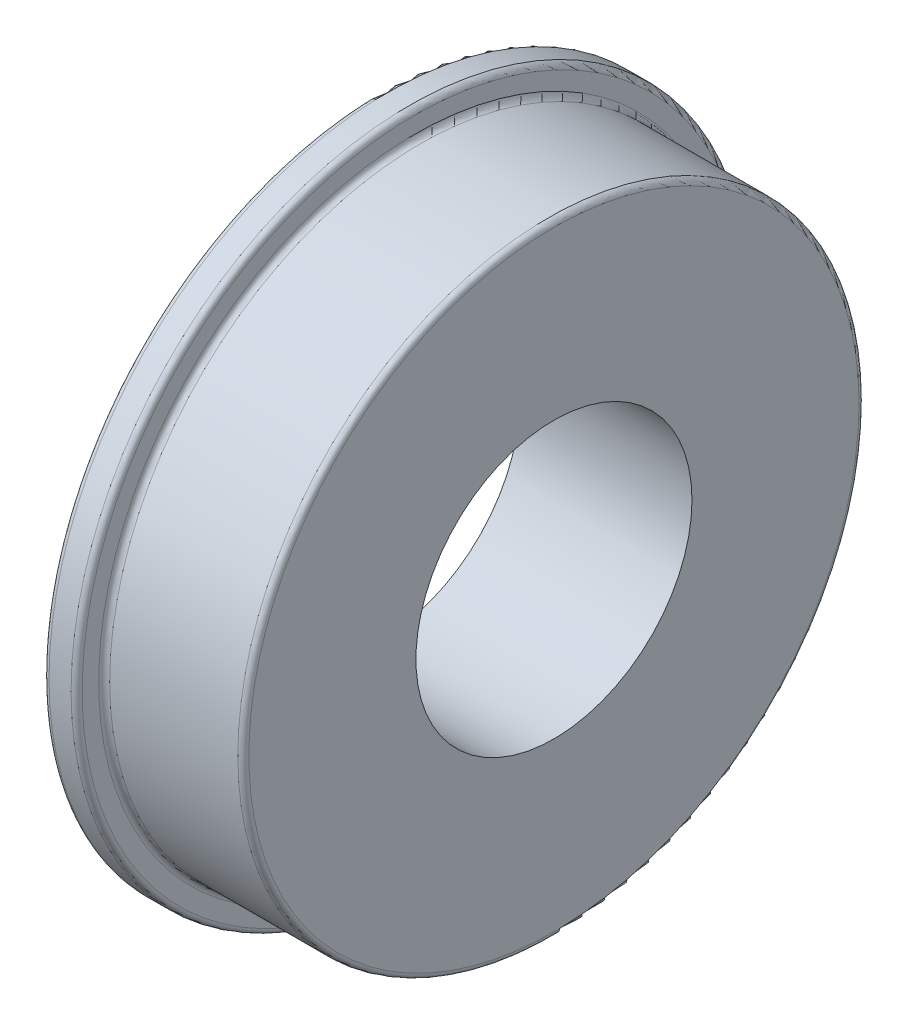
ISO-10303-21;
HEADER;
FILE_DESCRIPTION(('STEP AP214'),'2;1');
FILE_NAME('part.step','',(''),(''),'','','');
FILE_SCHEMA(('AUTOMOTIVE_DESIGN { 1 0 10303 214 1 1 1 1 }'));
ENDSEC;
DATA;
#1=APPLICATION_CONTEXT('core data for automotive mechanical design processes');
#2=APPLICATION_PROTOCOL_DEFINITION('international standard','automotive_design',2000,#1);
#3=PRODUCT_CONTEXT('',#1,'mechanical');
#4=PRODUCT('Part','Part','',(#3));
#5=PRODUCT_RELATED_PRODUCT_CATEGORY('part','',(#4));
#6=PRODUCT_DEFINITION_FORMATION('','',#4);
#7=PRODUCT_DEFINITION_CONTEXT('part definition',#1,'design');
#8=PRODUCT_DEFINITION('design','',#6,#7);
#9=PRODUCT_DEFINITION_SHAPE('','',#8);
#10=(LENGTH_UNIT() NAMED_UNIT(*) SI_UNIT(.MILLI.,.METRE.));
#11=(NAMED_UNIT(*) PLANE_ANGLE_UNIT() SI_UNIT($,.RADIAN.));
#12=(NAMED_UNIT(*) SI_UNIT($,.STERADIAN.) SOLID_ANGLE_UNIT());
#13=UNCERTAINTY_MEASURE_WITH_UNIT(LENGTH_MEASURE(1.E-05),#10,'distance_accuracy_value','');
#14=(GEOMETRIC_REPRESENTATION_CONTEXT(3) GLOBAL_UNCERTAINTY_ASSIGNED_CONTEXT((#13)) GLOBAL_UNIT_ASSIGNED_CONTEXT((#10,
#11,#12)) REPRESENTATION_CONTEXT('',''));
#15=CARTESIAN_POINT('',(0.,0.,0.));
#16=DIRECTION('',(0.,0.,1.));
#17=DIRECTION('',(1.,0.,0.));
#18=AXIS2_PLACEMENT_3D('',#15,#16,#17);
#19=CARTESIAN_POINT('',(1.524,0.,0.));
#20=DIRECTION('',(1.,0.,0.));
#21=DIRECTION('',(0.,0.,-1.));
#22=AXIS2_PLACEMENT_3D('',#19,#20,#21);
#23=PLANE('',#22);
#24=CARTESIAN_POINT('',(1.524,0.,0.));
#25=DIRECTION('',(1.,0.,0.));
#26=DIRECTION('',(0.,0.,-1.));
#27=AXIS2_PLACEMENT_3D('',#24,#25,#26);
#28=CIRCLE('',#27,15.3035);
#29=CARTESIAN_POINT('',(1.524,0.,-15.3035));
#30=VERTEX_POINT('',#29);
#31=EDGE_CURVE('E56',#30,#30,#28,.T.);
#32=ORIENTED_EDGE('',*,*,#31,.T.);
#33=EDGE_LOOP('',(#32));
#34=FACE_BOUND('',#33,.T.);
#35=CARTESIAN_POINT('',(1.524,0.,0.));
#36=DIRECTION('',(1.,0.,0.));
#37=DIRECTION('',(0.,0.,-1.));
#38=AXIS2_PLACEMENT_3D('',#35,#36,#37);
#39=CIRCLE('',#38,14.5415);
#40=CARTESIAN_POINT('',(1.524,0.,-14.5415));
#41=VERTEX_POINT('',#40);
#42=EDGE_CURVE('E59',#41,#41,#39,.F.);
#43=ORIENTED_EDGE('',*,*,#42,.T.);
#44=EDGE_LOOP('',(#43));
#45=FACE_BOUND('',#44,.T.);
#46=ADVANCED_FACE('F30',(#34,#45),#23,.T.);
#47=CARTESIAN_POINT('',(1.524,0.,0.));
#48=DIRECTION('',(-1.,0.,0.));
#49=DIRECTION('',(0.,0.,1.));
#50=AXIS2_PLACEMENT_3D('',#47,#48,#49);
#51=CYLINDRICAL_SURFACE('',#50,15.5575);
#52=CARTESIAN_POINT('',(1.27,0.,0.));
#53=DIRECTION('',(1.,0.,0.));
#54=DIRECTION('',(0.,0.,-1.));
#55=AXIS2_PLACEMENT_3D('',#52,#53,#54);
#56=CIRCLE('',#55,15.5575);
#57=CARTESIAN_POINT('',(1.27,0.,15.5575));
#58=VERTEX_POINT('',#57);
#59=EDGE_CURVE('E50',#58,#58,#56,.F.);
#60=CARTESIAN_POINT('',(0.254,0.,0.));
#61=DIRECTION('',(1.,0.,0.));
#62=DIRECTION('',(0.,0.,-1.));
#63=AXIS2_PLACEMENT_3D('',#60,#61,#62);
#64=CIRCLE('',#63,15.5575);
#65=CARTESIAN_POINT('',(0.254,0.,15.5575));
#66=VERTEX_POINT('',#65);
#67=EDGE_CURVE('E53',#66,#66,#64,.T.);
#68=CARTESIAN_POINT('',(1.27,0.,15.5575));
#69=CARTESIAN_POINT('',(1.25941666666667,0.,15.5575));
#70=CARTESIAN_POINT('',(1.24883333333333,0.,15.5575));
#71=CARTESIAN_POINT('',(1.22766666666667,0.,15.5575));
#72=CARTESIAN_POINT('',(1.21708333333333,0.,15.5575));
#73=CARTESIAN_POINT('',(1.19591666666667,0.,15.5575));
#74=CARTESIAN_POINT('',(1.18533333333333,0.,15.5575));
#75=CARTESIAN_POINT('',(1.16416666666667,0.,15.5575));
#76=CARTESIAN_POINT('',(1.15358333333333,0.,15.5575));
#77=CARTESIAN_POINT('',(1.13241666666667,0.,15.5575));
#78=CARTESIAN_POINT('',(1.12183333333333,0.,15.5575));
#79=CARTESIAN_POINT('',(1.10066666666667,0.,15.5575));
#80=CARTESIAN_POINT('',(1.09008333333333,0.,15.5575));
#81=CARTESIAN_POINT('',(1.06891666666667,0.,15.5575));
#82=CARTESIAN_POINT('',(1.05833333333333,0.,15.5575));
#83=CARTESIAN_POINT('',(1.03716666666667,0.,15.5575));
#84=CARTESIAN_POINT('',(1.02658333333333,0.,15.5575));
#85=CARTESIAN_POINT('',(1.00541666666667,0.,15.5575));
#86=CARTESIAN_POINT('',(0.994833333333333,0.,15.5575));
#87=CARTESIAN_POINT('',(0.973666666666667,0.,15.5575));
#88=CARTESIAN_POINT('',(0.963083333333333,0.,15.5575));
#89=CARTESIAN_POINT('',(0.941916666666666,0.,15.5575));
#90=CARTESIAN_POINT('',(0.931333333333333,0.,15.5575));
#91=CARTESIAN_POINT('',(0.910166666666666,0.,15.5575));
#92=CARTESIAN_POINT('',(0.899583333333333,0.,15.5575));
#93=CARTESIAN_POINT('',(0.878416666666666,0.,15.5575));
#94=CARTESIAN_POINT('',(0.867833333333333,0.,15.5575));
#95=CARTESIAN_POINT('',(0.846666666666666,0.,15.5575));
#96=CARTESIAN_POINT('',(0.836083333333333,0.,15.5575));
#97=CARTESIAN_POINT('',(0.814916666666666,0.,15.5575));
#98=CARTESIAN_POINT('',(0.804333333333333,0.,15.5575));
#99=CARTESIAN_POINT('',(0.783166666666666,0.,15.5575));
#100=CARTESIAN_POINT('',(0.772583333333333,0.,15.5575));
#101=CARTESIAN_POINT('',(0.751416666666666,0.,15.5575));
#102=CARTESIAN_POINT('',(0.740833333333333,0.,15.5575));
#103=CARTESIAN_POINT('',(0.719666666666666,0.,15.5575));
#104=CARTESIAN_POINT('',(0.709083333333333,0.,15.5575));
#105=CARTESIAN_POINT('',(0.687916666666666,0.,15.5575));
#106=CARTESIAN_POINT('',(0.677333333333333,0.,15.5575));
#107=CARTESIAN_POINT('',(0.656166666666666,0.,15.5575));
#108=CARTESIAN_POINT('',(0.645583333333333,0.,15.5575));
#109=CARTESIAN_POINT('',(0.624416666666667,0.,15.5575));
#110=CARTESIAN_POINT('',(0.613833333333333,0.,15.5575));
#111=CARTESIAN_POINT('',(0.592666666666666,0.,15.5575));
#112=CARTESIAN_POINT('',(0.582083333333333,0.,15.5575));
#113=CARTESIAN_POINT('',(0.560916666666667,0.,15.5575));
#114=CARTESIAN_POINT('',(0.550333333333333,0.,15.5575));
#115=CARTESIAN_POINT('',(0.529166666666666,0.,15.5575));
#116=CARTESIAN_POINT('',(0.518583333333333,0.,15.5575));
#117=CARTESIAN_POINT('',(0.497416666666667,0.,15.5575));
#118=CARTESIAN_POINT('',(0.486833333333333,0.,15.5575));
#119=CARTESIAN_POINT('',(0.465666666666667,0.,15.5575));
#120=CARTESIAN_POINT('',(0.455083333333333,0.,15.5575));
#121=CARTESIAN_POINT('',(0.433916666666667,0.,15.5575));
#122=CARTESIAN_POINT('',(0.423333333333333,0.,15.5575));
#123=CARTESIAN_POINT('',(0.402166666666667,0.,15.5575));
#124=CARTESIAN_POINT('',(0.391583333333333,0.,15.5575));
#125=CARTESIAN_POINT('',(0.370416666666666,0.,15.5575));
#126=CARTESIAN_POINT('',(0.359833333333333,0.,15.5575));
#127=CARTESIAN_POINT('',(0.338666666666666,0.,15.5575));
#128=CARTESIAN_POINT('',(0.328083333333333,0.,15.5575));
#129=CARTESIAN_POINT('',(0.306916666666667,0.,15.5575));
#130=CARTESIAN_POINT('',(0.296333333333333,0.,15.5575));
#131=CARTESIAN_POINT('',(0.275166666666667,0.,15.5575));
#132=CARTESIAN_POINT('',(0.264583333333333,0.,15.5575));
#133=CARTESIAN_POINT('',(0.254,0.,15.5575));
#134=B_SPLINE_CURVE_WITH_KNOTS('',3,(#68,#69,#70,#71,#72,#73,#74,#75,#76,#77,#78,#79,#80,#81,
#82,#83,#84,#85,#86,#87,#88,#89,#90,#91,#92,#93,#94,#95,#96,#97,#98,#99,#100,#101,#102,#103,
#104,#105,#106,#107,#108,#109,#110,#111,#112,#113,#114,#115,#116,#117,#118,#119,#120,#121,#122,
#123,#124,#125,#126,#127,#128,#129,#130,#131,#132,#133),.UNSPECIFIED.,.F.,.F.,(4,2,2,2,2,2,2,2,
2,2,2,2,2,2,2,2,2,2,2,2,2,2,2,2,2,2,2,2,2,2,2,2,4),(0.,0.0317499999999999,0.0635,
0.0952500000000001,0.127,0.15875,0.1905,0.22225,0.254,0.28575,0.3175,0.34925,0.381,0.41275,
0.4445,0.47625,0.508,0.53975,0.5715,0.60325,0.635,0.66675,0.6985,0.73025,0.762,0.79375,0.8255,
0.85725,0.889,0.92075,0.9525,0.98425,1.016),.UNSPECIFIED.);
#135=EDGE_CURVE('BSEAM87',#58,#66,#134,.T.);
#136=ORIENTED_EDGE('',*,*,#59,.T.);
#137=ORIENTED_EDGE('',*,*,#67,.T.);
#138=ORIENTED_EDGE('',*,*,#135,.T.);
#139=ORIENTED_EDGE('',*,*,#135,.F.);
#140=EDGE_LOOP('',(#136,#138,#137,#139));
#141=FACE_BOUND('',#140,.T.);
#142=ADVANCED_FACE('F87',(#141),#51,.T.);
#143=CARTESIAN_POINT('',(0.,0.,0.));
#144=DIRECTION('',(1.,0.,0.));
#145=DIRECTION('',(0.,0.,-1.));
#146=AXIS2_PLACEMENT_3D('',#143,#144,#145);
#147=PLANE('',#146);
#148=CARTESIAN_POINT('',(0.,0.,0.));
#149=DIRECTION('',(1.,0.,0.));
#150=DIRECTION('',(0.,0.,-1.));
#151=AXIS2_PLACEMENT_3D('',#148,#149,#150);
#152=CIRCLE('',#151,15.3035);
#153=CARTESIAN_POINT('',(0.,0.,-15.3035));
#154=VERTEX_POINT('',#153);
#155=EDGE_CURVE('E45',#154,#154,#152,.F.);
#156=ORIENTED_EDGE('',*,*,#155,.T.);
#157=EDGE_LOOP('',(#156));
#158=FACE_BOUND('',#157,.T.);
#159=CARTESIAN_POINT('',(0.,0.,0.));
#160=DIRECTION('',(1.,0.,0.));
#161=DIRECTION('',(0.,0.,-1.));
#162=AXIS2_PLACEMENT_3D('',#159,#160,#161);
#163=CIRCLE('',#162,6.35);
#164=CARTESIAN_POINT('',(0.,0.,-6.35));
#165=VERTEX_POINT('',#164);
#166=EDGE_CURVE('E62',#165,#165,#163,.T.);
#167=ORIENTED_EDGE('',*,*,#166,.T.);
#168=EDGE_LOOP('',(#167));
#169=FACE_BOUND('',#168,.T.);
#170=ADVANCED_FACE('F69',(#158,#169),#147,.F.);
#171=CARTESIAN_POINT('',(7.9248,0.,0.));
#172=DIRECTION('',(-1.,0.,0.));
#173=DIRECTION('',(0.,0.,1.));
#174=AXIS2_PLACEMENT_3D('',#171,#172,#173);
#175=CYLINDRICAL_SURFACE('',#174,14.2875);
#176=CARTESIAN_POINT('',(1.778,0.,0.));
#177=DIRECTION('',(1.,0.,0.));
#178=DIRECTION('',(0.,0.,-1.));
#179=AXIS2_PLACEMENT_3D('',#176,#177,#178);
#180=CIRCLE('',#179,14.2875);
#181=CARTESIAN_POINT('',(1.778,0.,-14.2875));
#182=VERTEX_POINT('',#181);
#183=EDGE_CURVE('E37',#182,#182,#180,.T.);
#184=ORIENTED_EDGE('',*,*,#183,.T.);
#185=EDGE_LOOP('',(#184));
#186=FACE_BOUND('',#185,.T.);
#187=CARTESIAN_POINT('',(7.6708,0.,0.));
#188=DIRECTION('',(1.,0.,0.));
#189=DIRECTION('',(0.,0.,-1.));
#190=AXIS2_PLACEMENT_3D('',#187,#188,#189);
#191=CIRCLE('',#190,14.2875);
#192=CARTESIAN_POINT('',(7.6708,0.,-14.2875));
#193=VERTEX_POINT('',#192);
#194=EDGE_CURVE('E41',#193,#193,#191,.F.);
#195=ORIENTED_EDGE('',*,*,#194,.T.);
#196=EDGE_LOOP('',(#195));
#197=FACE_BOUND('',#196,.T.);
#198=ADVANCED_FACE('F80',(#186,#197),#175,.T.);
#199=CARTESIAN_POINT('',(7.9248,0.,0.));
#200=DIRECTION('',(1.,0.,0.));
#201=DIRECTION('',(0.,0.,-1.));
#202=AXIS2_PLACEMENT_3D('',#199,#200,#201);
#203=PLANE('',#202);
#204=CARTESIAN_POINT('',(7.9248,0.,0.));
#205=DIRECTION('',(1.,0.,0.));
#206=DIRECTION('',(0.,0.,-1.));
#207=AXIS2_PLACEMENT_3D('',#204,#205,#206);
#208=CIRCLE('',#207,14.0335);
#209=CARTESIAN_POINT('',(7.9248,0.,-14.0335));
#210=VERTEX_POINT('',#209);
#211=EDGE_CURVE('E10',#210,#210,#208,.T.);
#212=ORIENTED_EDGE('',*,*,#211,.T.);
#213=EDGE_LOOP('',(#212));
#214=FACE_BOUND('',#213,.T.);
#215=CARTESIAN_POINT('',(7.9248,0.,0.));
#216=DIRECTION('',(1.,0.,0.));
#217=DIRECTION('',(0.,0.,-1.));
#218=AXIS2_PLACEMENT_3D('',#215,#216,#217);
#219=CIRCLE('',#218,6.35);
#220=CARTESIAN_POINT('',(7.9248,0.,-6.35));
#221=VERTEX_POINT('',#220);
#222=EDGE_CURVE('E63',#221,#221,#219,.T.);
#223=ORIENTED_EDGE('',*,*,#222,.F.);
#224=EDGE_LOOP('',(#223));
#225=FACE_BOUND('',#224,.T.);
#226=ADVANCED_FACE('F75',(#214,#225),#203,.T.);
#227=CARTESIAN_POINT('',(0.,0.,0.));
#228=DIRECTION('',(1.,0.,0.));
#229=DIRECTION('',(0.,0.,-1.));
#230=AXIS2_PLACEMENT_3D('',#227,#228,#229);
#231=CYLINDRICAL_SURFACE('',#230,6.35);
#232=ORIENTED_EDGE('',*,*,#166,.F.);
#233=EDGE_LOOP('',(#232));
#234=FACE_BOUND('',#233,.T.);
#235=ORIENTED_EDGE('',*,*,#222,.T.);
#236=EDGE_LOOP('',(#235));
#237=FACE_BOUND('',#236,.T.);
#238=ADVANCED_FACE('F71',(#234,#237),#231,.F.);
#239=CARTESIAN_POINT('',(1.27,0.,0.));
#240=DIRECTION('',(1.,0.,0.));
#241=DIRECTION('',(0.,0.,-1.));
#242=AXIS2_PLACEMENT_3D('',#239,#240,#241);
#243=TOROIDAL_SURFACE('',#242,15.3035,0.254);
#244=ORIENTED_EDGE('',*,*,#59,.F.);
#245=EDGE_LOOP('',(#244));
#246=FACE_BOUND('',#245,.T.);
#247=ORIENTED_EDGE('',*,*,#31,.F.);
#248=EDGE_LOOP('',(#247));
#249=FACE_BOUND('',#248,.T.);
#250=ADVANCED_FACE('F74',(#246,#249),#243,.T.);
#251=CARTESIAN_POINT('',(0.254,0.,0.));
#252=DIRECTION('',(1.,0.,0.));
#253=DIRECTION('',(0.,0.,-1.));
#254=AXIS2_PLACEMENT_3D('',#251,#252,#253);
#255=TOROIDAL_SURFACE('',#254,15.3035,0.254);
#256=ORIENTED_EDGE('',*,*,#155,.F.);
#257=EDGE_LOOP('',(#256));
#258=FACE_BOUND('',#257,.T.);
#259=ORIENTED_EDGE('',*,*,#67,.F.);
#260=EDGE_LOOP('',(#259));
#261=FACE_BOUND('',#260,.T.);
#262=ADVANCED_FACE('F102',(#258,#261),#255,.T.);
#263=CARTESIAN_POINT('',(1.778,0.,0.));
#264=DIRECTION('',(1.,0.,0.));
#265=DIRECTION('',(0.,0.,-1.));
#266=AXIS2_PLACEMENT_3D('',#263,#264,#265);
#267=TOROIDAL_SURFACE('',#266,14.5415,0.254);
#268=ORIENTED_EDGE('',*,*,#42,.F.);
#269=EDGE_LOOP('',(#268));
#270=FACE_BOUND('',#269,.T.);
#271=ORIENTED_EDGE('',*,*,#183,.F.);
#272=EDGE_LOOP('',(#271));
#273=FACE_BOUND('',#272,.T.);
#274=ADVANCED_FACE('F105',(#270,#273),#267,.F.);
#275=CARTESIAN_POINT('',(7.6708,0.,0.));
#276=DIRECTION('',(1.,0.,0.));
#277=DIRECTION('',(0.,0.,-1.));
#278=AXIS2_PLACEMENT_3D('',#275,#276,#277);
#279=TOROIDAL_SURFACE('',#278,14.0335,0.254);
#280=ORIENTED_EDGE('',*,*,#194,.F.);
#281=EDGE_LOOP('',(#280));
#282=FACE_BOUND('',#281,.T.);
#283=ORIENTED_EDGE('',*,*,#211,.F.);
#284=EDGE_LOOP('',(#283));
#285=FACE_BOUND('',#284,.T.);
#286=ADVANCED_FACE('F32',(#282,#285),#279,.T.);
#287=CLOSED_SHELL('',(#46,#142,#170,#198,#226,#238,#250,#262,#274,#286));
#288=MANIFOLD_SOLID_BREP('B2',#287);
#289=ADVANCED_BREP_SHAPE_REPRESENTATION('',(#18,#288),#14);
#290=SHAPE_DEFINITION_REPRESENTATION(#9,#289);
ENDSEC;
END-ISO-10303-21;
